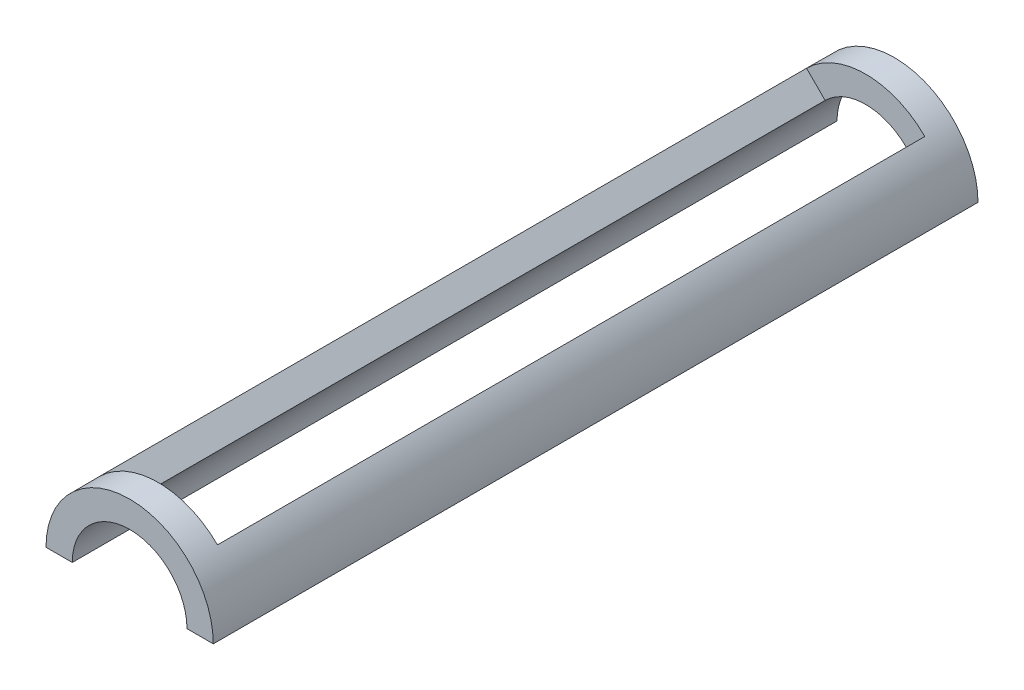
ISO-10303-21;
HEADER;
FILE_DESCRIPTION(('STEP AP214'),'2;1');
FILE_NAME('part.step','',(''),(''),'','','');
FILE_SCHEMA(('AUTOMOTIVE_DESIGN { 1 0 10303 214 1 1 1 1 }'));
ENDSEC;
DATA;
#1=APPLICATION_CONTEXT('core data for automotive mechanical design processes');
#2=APPLICATION_PROTOCOL_DEFINITION('international standard','automotive_design',2000,#1);
#3=PRODUCT_CONTEXT('',#1,'mechanical');
#4=PRODUCT('Part','Part','',(#3));
#5=PRODUCT_RELATED_PRODUCT_CATEGORY('part','',(#4));
#6=PRODUCT_DEFINITION_FORMATION('','',#4);
#7=PRODUCT_DEFINITION_CONTEXT('part definition',#1,'design');
#8=PRODUCT_DEFINITION('design','',#6,#7);
#9=PRODUCT_DEFINITION_SHAPE('','',#8);
#10=(LENGTH_UNIT() NAMED_UNIT(*) SI_UNIT(.MILLI.,.METRE.));
#11=(NAMED_UNIT(*) PLANE_ANGLE_UNIT() SI_UNIT($,.RADIAN.));
#12=(NAMED_UNIT(*) SI_UNIT($,.STERADIAN.) SOLID_ANGLE_UNIT());
#13=UNCERTAINTY_MEASURE_WITH_UNIT(LENGTH_MEASURE(1.E-05),#10,'distance_accuracy_value','');
#14=(GEOMETRIC_REPRESENTATION_CONTEXT(3) GLOBAL_UNCERTAINTY_ASSIGNED_CONTEXT((#13)) GLOBAL_UNIT_ASSIGNED_CONTEXT((#10,
#11,#12)) REPRESENTATION_CONTEXT('',''));
#15=CARTESIAN_POINT('',(0.,0.,0.));
#16=DIRECTION('',(0.,0.,1.));
#17=DIRECTION('',(1.,0.,0.));
#18=AXIS2_PLACEMENT_3D('',#15,#16,#17);
#19=CARTESIAN_POINT('',(0.,0.,80.));
#20=DIRECTION('',(0.,0.,-1.));
#21=DIRECTION('',(-1.,0.,0.));
#22=AXIS2_PLACEMENT_3D('',#19,#20,#21);
#23=CYLINDRICAL_SURFACE('',#22,17.5);
#24=CARTESIAN_POINT('',(0.,0.,-80.));
#25=DIRECTION('',(0.,0.,1.));
#26=DIRECTION('',(1.,0.,0.));
#27=AXIS2_PLACEMENT_3D('',#24,#25,#26);
#28=CIRCLE('',#27,17.5);
#29=CARTESIAN_POINT('',(17.5,0.,-80.));
#30=VERTEX_POINT('',#29);
#31=CARTESIAN_POINT('',(-17.5,0.,-80.));
#32=VERTEX_POINT('',#31);
#33=EDGE_CURVE('E121',#30,#32,#28,.T.);
#34=ORIENTED_EDGE('',*,*,#33,.T.);
#35=DIRECTION('',(0.,0.,-1.));
#36=VECTOR('',#35,1.);
#37=CARTESIAN_POINT('',(-17.5,0.,80.));
#38=LINE('',#37,#36);
#39=CARTESIAN_POINT('',(-17.5,0.,80.));
#40=VERTEX_POINT('',#39);
#41=EDGE_CURVE('E149',#40,#32,#38,.T.);
#42=ORIENTED_EDGE('',*,*,#41,.F.);
#43=CARTESIAN_POINT('',(0.,0.,80.));
#44=DIRECTION('',(0.,0.,1.));
#45=DIRECTION('',(1.,0.,0.));
#46=AXIS2_PLACEMENT_3D('',#43,#44,#45);
#47=CIRCLE('',#46,17.5);
#48=CARTESIAN_POINT('',(17.5,0.,80.));
#49=VERTEX_POINT('',#48);
#50=EDGE_CURVE('E123',#49,#40,#47,.T.);
#51=ORIENTED_EDGE('',*,*,#50,.F.);
#52=DIRECTION('',(0.,0.,-1.));
#53=VECTOR('',#52,1.);
#54=CARTESIAN_POINT('',(17.5,0.,80.));
#55=LINE('',#54,#53);
#56=EDGE_CURVE('E133',#49,#30,#55,.T.);
#57=ORIENTED_EDGE('',*,*,#56,.T.);
#58=EDGE_LOOP('',(#34,#42,#51,#57));
#59=FACE_BOUND('',#58,.T.);
#60=CARTESIAN_POINT('',(0.,0.,-74.));
#61=DIRECTION('',(0.,0.,1.));
#62=DIRECTION('',(1.,0.,0.));
#63=AXIS2_PLACEMENT_3D('',#60,#61,#62);
#64=CIRCLE('',#63,17.5);
#65=CARTESIAN_POINT('',(12.3743686707646,12.3743686707646,-74.));
#66=VERTEX_POINT('',#65);
#67=CARTESIAN_POINT('',(-12.3743686707646,12.3743686707646,-74.));
#68=VERTEX_POINT('',#67);
#69=EDGE_CURVE('E100',#66,#68,#64,.T.);
#70=ORIENTED_EDGE('',*,*,#69,.F.);
#71=DIRECTION('',(0.,0.,1.));
#72=VECTOR('',#71,1.);
#73=CARTESIAN_POINT('',(12.3743686707646,12.3743686707646,-74.));
#74=LINE('',#73,#72);
#75=CARTESIAN_POINT('',(12.3743686707646,12.3743686707646,74.));
#76=VERTEX_POINT('',#75);
#77=EDGE_CURVE('E108',#66,#76,#74,.T.);
#78=ORIENTED_EDGE('',*,*,#77,.T.);
#79=CARTESIAN_POINT('',(0.,0.,74.));
#80=DIRECTION('',(0.,0.,1.));
#81=DIRECTION('',(1.,0.,0.));
#82=AXIS2_PLACEMENT_3D('',#79,#80,#81);
#83=CIRCLE('',#82,17.5);
#84=CARTESIAN_POINT('',(-12.3743686707646,12.3743686707646,74.));
#85=VERTEX_POINT('',#84);
#86=EDGE_CURVE('E119',#76,#85,#83,.T.);
#87=ORIENTED_EDGE('',*,*,#86,.T.);
#88=DIRECTION('',(0.,0.,1.));
#89=VECTOR('',#88,1.);
#90=CARTESIAN_POINT('',(-12.3743686707646,12.3743686707646,-74.));
#91=LINE('',#90,#89);
#92=EDGE_CURVE('E112',#68,#85,#91,.T.);
#93=ORIENTED_EDGE('',*,*,#92,.F.);
#94=EDGE_LOOP('',(#70,#78,#87,#93));
#95=FACE_BOUND('',#94,.T.);
#96=ADVANCED_FACE('F33',(#59,#95),#23,.T.);
#97=CARTESIAN_POINT('',(0.,0.,80.));
#98=DIRECTION('',(0.,0.,-1.));
#99=DIRECTION('',(-1.,0.,0.));
#100=AXIS2_PLACEMENT_3D('',#97,#98,#99);
#101=CYLINDRICAL_SURFACE('',#100,12.);
#102=CARTESIAN_POINT('',(0.,0.,-80.));
#103=DIRECTION('',(0.,0.,-1.));
#104=DIRECTION('',(1.,0.,0.));
#105=AXIS2_PLACEMENT_3D('',#102,#103,#104);
#106=CIRCLE('',#105,12.);
#107=CARTESIAN_POINT('',(-12.,0.,-80.));
#108=VERTEX_POINT('',#107);
#109=CARTESIAN_POINT('',(12.,0.,-80.));
#110=VERTEX_POINT('',#109);
#111=EDGE_CURVE('E138',#108,#110,#106,.T.);
#112=ORIENTED_EDGE('',*,*,#111,.T.);
#113=DIRECTION('',(0.,0.,-1.));
#114=VECTOR('',#113,1.);
#115=CARTESIAN_POINT('',(12.,0.,80.));
#116=LINE('',#115,#114);
#117=CARTESIAN_POINT('',(12.,0.,80.));
#118=VERTEX_POINT('',#117);
#119=EDGE_CURVE('E143',#118,#110,#116,.T.);
#120=ORIENTED_EDGE('',*,*,#119,.F.);
#121=CARTESIAN_POINT('',(0.,0.,80.));
#122=DIRECTION('',(0.,0.,-1.));
#123=DIRECTION('',(1.,0.,0.));
#124=AXIS2_PLACEMENT_3D('',#121,#122,#123);
#125=CIRCLE('',#124,12.);
#126=CARTESIAN_POINT('',(-12.,0.,80.));
#127=VERTEX_POINT('',#126);
#128=EDGE_CURVE('E129',#127,#118,#125,.T.);
#129=ORIENTED_EDGE('',*,*,#128,.F.);
#130=DIRECTION('',(0.,0.,-1.));
#131=VECTOR('',#130,1.);
#132=CARTESIAN_POINT('',(-12.,0.,80.));
#133=LINE('',#132,#131);
#134=EDGE_CURVE('E146',#127,#108,#133,.T.);
#135=ORIENTED_EDGE('',*,*,#134,.T.);
#136=EDGE_LOOP('',(#112,#120,#129,#135));
#137=FACE_BOUND('',#136,.T.);
#138=CARTESIAN_POINT('',(0.,0.,-74.));
#139=DIRECTION('',(0.,0.,1.));
#140=DIRECTION('',(1.,0.,0.));
#141=AXIS2_PLACEMENT_3D('',#138,#139,#140);
#142=CIRCLE('',#141,12.);
#143=CARTESIAN_POINT('',(-8.48528137423859,8.48528137423856,-74.));
#144=VERTEX_POINT('',#143);
#145=CARTESIAN_POINT('',(8.48528137423859,8.48528137423856,-74.));
#146=VERTEX_POINT('',#145);
#147=EDGE_CURVE('E11',#144,#146,#142,.F.);
#148=ORIENTED_EDGE('',*,*,#147,.F.);
#149=DIRECTION('',(0.,0.,-1.));
#150=VECTOR('',#149,1.);
#151=CARTESIAN_POINT('',(-8.48528137423859,8.48528137423856,80.));
#152=LINE('',#151,#150);
#153=CARTESIAN_POINT('',(-8.48528137423859,8.48528137423856,74.));
#154=VERTEX_POINT('',#153);
#155=EDGE_CURVE('E40',#144,#154,#152,.F.);
#156=ORIENTED_EDGE('',*,*,#155,.T.);
#157=CARTESIAN_POINT('',(0.,0.,74.));
#158=DIRECTION('',(0.,0.,1.));
#159=DIRECTION('',(1.,0.,0.));
#160=AXIS2_PLACEMENT_3D('',#157,#158,#159);
#161=CIRCLE('',#160,12.);
#162=CARTESIAN_POINT('',(8.48528137423859,8.48528137423856,74.));
#163=VERTEX_POINT('',#162);
#164=EDGE_CURVE('E152',#154,#163,#161,.F.);
#165=ORIENTED_EDGE('',*,*,#164,.T.);
#166=DIRECTION('',(0.,0.,-1.));
#167=VECTOR('',#166,1.);
#168=CARTESIAN_POINT('',(8.48528137423859,8.48528137423856,80.));
#169=LINE('',#168,#167);
#170=EDGE_CURVE('E155',#163,#146,#169,.T.);
#171=ORIENTED_EDGE('',*,*,#170,.T.);
#172=EDGE_LOOP('',(#148,#156,#165,#171));
#173=FACE_BOUND('',#172,.T.);
#174=ADVANCED_FACE('F158',(#137,#173),#101,.F.);
#175=CARTESIAN_POINT('',(-12.,0.,80.));
#176=DIRECTION('',(0.,1.,0.));
#177=DIRECTION('',(0.,0.,1.));
#178=AXIS2_PLACEMENT_3D('',#175,#176,#177);
#179=PLANE('',#178);
#180=DIRECTION('',(1.,0.,0.));
#181=VECTOR('',#180,1.);
#182=CARTESIAN_POINT('',(-12.,0.,-80.));
#183=LINE('',#182,#181);
#184=EDGE_CURVE('E136',#32,#108,#183,.T.);
#185=ORIENTED_EDGE('',*,*,#184,.T.);
#186=ORIENTED_EDGE('',*,*,#134,.F.);
#187=DIRECTION('',(1.,0.,0.));
#188=VECTOR('',#187,1.);
#189=CARTESIAN_POINT('',(-12.,0.,80.));
#190=LINE('',#189,#188);
#191=EDGE_CURVE('E126',#40,#127,#190,.T.);
#192=ORIENTED_EDGE('',*,*,#191,.F.);
#193=ORIENTED_EDGE('',*,*,#41,.T.);
#194=EDGE_LOOP('',(#185,#186,#192,#193));
#195=FACE_BOUND('',#194,.T.);
#196=ADVANCED_FACE('F174',(#195),#179,.F.);
#197=CARTESIAN_POINT('',(17.5,0.,80.));
#198=DIRECTION('',(0.,1.,0.));
#199=DIRECTION('',(0.,0.,1.));
#200=AXIS2_PLACEMENT_3D('',#197,#198,#199);
#201=PLANE('',#200);
#202=DIRECTION('',(1.,0.,0.));
#203=VECTOR('',#202,1.);
#204=CARTESIAN_POINT('',(17.5,0.,-80.));
#205=LINE('',#204,#203);
#206=EDGE_CURVE('E127',#110,#30,#205,.T.);
#207=ORIENTED_EDGE('',*,*,#206,.T.);
#208=ORIENTED_EDGE('',*,*,#56,.F.);
#209=DIRECTION('',(1.,0.,0.));
#210=VECTOR('',#209,1.);
#211=CARTESIAN_POINT('',(17.5,0.,80.));
#212=LINE('',#211,#210);
#213=EDGE_CURVE('E131',#118,#49,#212,.T.);
#214=ORIENTED_EDGE('',*,*,#213,.F.);
#215=ORIENTED_EDGE('',*,*,#119,.T.);
#216=EDGE_LOOP('',(#207,#208,#214,#215));
#217=FACE_BOUND('',#216,.T.);
#218=ADVANCED_FACE('F193',(#217),#201,.F.);
#219=CARTESIAN_POINT('',(0.,0.,80.));
#220=DIRECTION('',(0.,0.,1.));
#221=DIRECTION('',(1.,0.,0.));
#222=AXIS2_PLACEMENT_3D('',#219,#220,#221);
#223=PLANE('',#222);
#224=ORIENTED_EDGE('',*,*,#50,.T.);
#225=ORIENTED_EDGE('',*,*,#191,.T.);
#226=ORIENTED_EDGE('',*,*,#128,.T.);
#227=ORIENTED_EDGE('',*,*,#213,.T.);
#228=EDGE_LOOP('',(#224,#225,#226,#227));
#229=FACE_BOUND('',#228,.T.);
#230=ADVANCED_FACE('F189',(#229),#223,.T.);
#231=CARTESIAN_POINT('',(0.,0.,-80.));
#232=DIRECTION('',(0.,0.,1.));
#233=DIRECTION('',(1.,0.,0.));
#234=AXIS2_PLACEMENT_3D('',#231,#232,#233);
#235=PLANE('',#234);
#236=ORIENTED_EDGE('',*,*,#33,.F.);
#237=ORIENTED_EDGE('',*,*,#206,.F.);
#238=ORIENTED_EDGE('',*,*,#111,.F.);
#239=ORIENTED_EDGE('',*,*,#184,.F.);
#240=EDGE_LOOP('',(#236,#237,#238,#239));
#241=FACE_BOUND('',#240,.T.);
#242=ADVANCED_FACE('F183',(#241),#235,.F.);
#243=CARTESIAN_POINT('',(0.,0.,-74.));
#244=DIRECTION('',(-0.707106781186546,-0.707106781186549,0.));
#245=DIRECTION('',(0.707106781186549,-0.707106781186546,0.));
#246=AXIS2_PLACEMENT_3D('',#243,#244,#245);
#247=PLANE('',#246);
#248=DIRECTION('',(0.707106781186549,-0.707106781186546,0.));
#249=VECTOR('',#248,1.);
#250=CARTESIAN_POINT('',(0.,0.,-74.));
#251=LINE('',#250,#249);
#252=EDGE_CURVE('E105',#68,#144,#251,.T.);
#253=ORIENTED_EDGE('',*,*,#252,.F.);
#254=ORIENTED_EDGE('',*,*,#92,.T.);
#255=DIRECTION('',(0.707106781186549,-0.707106781186546,0.));
#256=VECTOR('',#255,1.);
#257=CARTESIAN_POINT('',(0.,0.,74.));
#258=LINE('',#257,#256);
#259=EDGE_CURVE('E47',#85,#154,#258,.T.);
#260=ORIENTED_EDGE('',*,*,#259,.T.);
#261=ORIENTED_EDGE('',*,*,#155,.F.);
#262=EDGE_LOOP('',(#253,#254,#260,#261));
#263=FACE_BOUND('',#262,.T.);
#264=ADVANCED_FACE('F160',(#263),#247,.F.);
#265=CARTESIAN_POINT('',(0.,0.,-74.));
#266=DIRECTION('',(0.707106781186546,-0.707106781186549,0.));
#267=DIRECTION('',(0.707106781186549,0.707106781186546,0.));
#268=AXIS2_PLACEMENT_3D('',#265,#266,#267);
#269=PLANE('',#268);
#270=DIRECTION('',(0.707106781186549,0.707106781186546,0.));
#271=VECTOR('',#270,1.);
#272=CARTESIAN_POINT('',(0.,0.,74.));
#273=LINE('',#272,#271);
#274=EDGE_CURVE('E52',#163,#76,#273,.T.);
#275=ORIENTED_EDGE('',*,*,#274,.T.);
#276=ORIENTED_EDGE('',*,*,#77,.F.);
#277=DIRECTION('',(0.707106781186549,0.707106781186546,0.));
#278=VECTOR('',#277,1.);
#279=CARTESIAN_POINT('',(0.,0.,-74.));
#280=LINE('',#279,#278);
#281=EDGE_CURVE('E95',#146,#66,#280,.T.);
#282=ORIENTED_EDGE('',*,*,#281,.F.);
#283=ORIENTED_EDGE('',*,*,#170,.F.);
#284=EDGE_LOOP('',(#275,#276,#282,#283));
#285=FACE_BOUND('',#284,.T.);
#286=ADVANCED_FACE('F109',(#285),#269,.F.);
#287=CARTESIAN_POINT('',(0.,0.,-74.));
#288=DIRECTION('',(0.,0.,1.));
#289=DIRECTION('',(1.,0.,0.));
#290=AXIS2_PLACEMENT_3D('',#287,#288,#289);
#291=PLANE('',#290);
#292=ORIENTED_EDGE('',*,*,#147,.T.);
#293=ORIENTED_EDGE('',*,*,#281,.T.);
#294=ORIENTED_EDGE('',*,*,#69,.T.);
#295=ORIENTED_EDGE('',*,*,#252,.T.);
#296=EDGE_LOOP('',(#292,#293,#294,#295));
#297=FACE_BOUND('',#296,.T.);
#298=ADVANCED_FACE('F97',(#297),#291,.T.);
#299=CARTESIAN_POINT('',(0.,0.,74.));
#300=DIRECTION('',(0.,0.,1.));
#301=DIRECTION('',(1.,0.,0.));
#302=AXIS2_PLACEMENT_3D('',#299,#300,#301);
#303=PLANE('',#302);
#304=ORIENTED_EDGE('',*,*,#259,.F.);
#305=ORIENTED_EDGE('',*,*,#86,.F.);
#306=ORIENTED_EDGE('',*,*,#274,.F.);
#307=ORIENTED_EDGE('',*,*,#164,.F.);
#308=EDGE_LOOP('',(#304,#305,#306,#307));
#309=FACE_BOUND('',#308,.T.);
#310=ADVANCED_FACE('F161',(#309),#303,.F.);
#311=CLOSED_SHELL('',(#96,#174,#196,#218,#230,#242,#264,#286,#298,#310));
#312=MANIFOLD_SOLID_BREP('B2',#311);
#313=ADVANCED_BREP_SHAPE_REPRESENTATION('',(#18,#312),#14);
#314=SHAPE_DEFINITION_REPRESENTATION(#9,#313);
ENDSEC;
END-ISO-10303-21;
